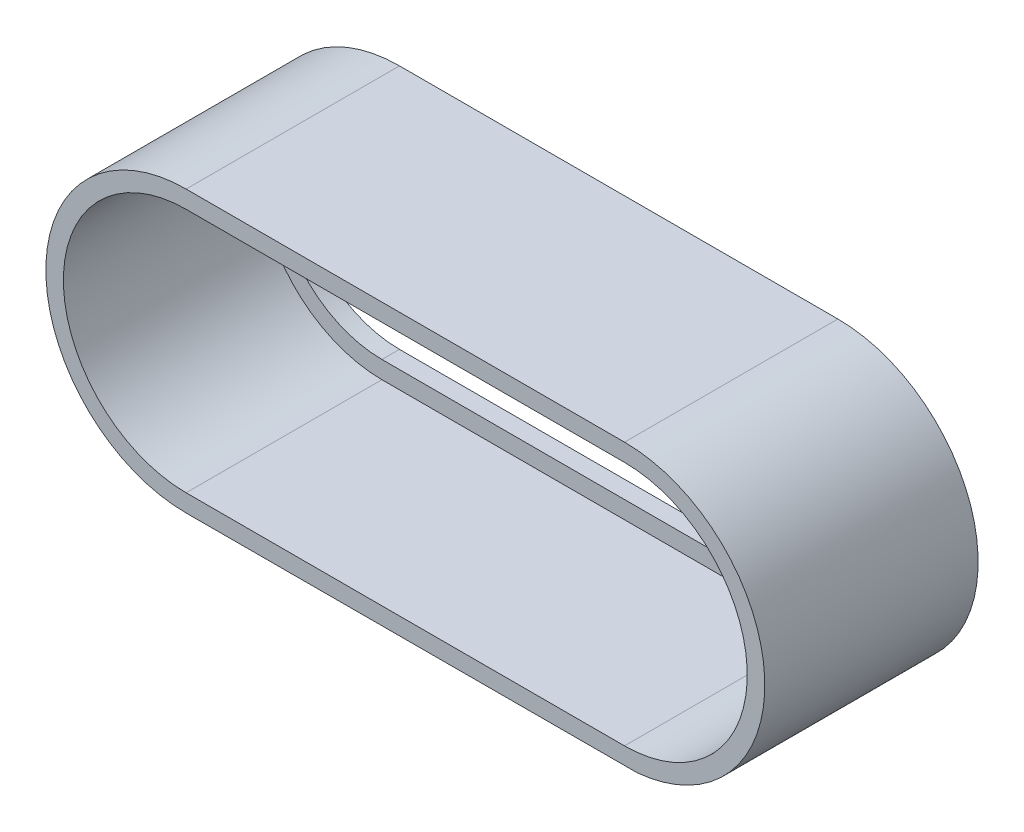
ISO-10303-21;
HEADER;
FILE_DESCRIPTION(('STEP AP214'),'2;1');
FILE_NAME('part.step','',(''),(''),'','','');
FILE_SCHEMA(('AUTOMOTIVE_DESIGN { 1 0 10303 214 1 1 1 1 }'));
ENDSEC;
DATA;
#1=APPLICATION_CONTEXT('core data for automotive mechanical design processes');
#2=APPLICATION_PROTOCOL_DEFINITION('international standard','automotive_design',2000,#1);
#3=PRODUCT_CONTEXT('',#1,'mechanical');
#4=PRODUCT('Part','Part','',(#3));
#5=PRODUCT_RELATED_PRODUCT_CATEGORY('part','',(#4));
#6=PRODUCT_DEFINITION_FORMATION('','',#4);
#7=PRODUCT_DEFINITION_CONTEXT('part definition',#1,'design');
#8=PRODUCT_DEFINITION('design','',#6,#7);
#9=PRODUCT_DEFINITION_SHAPE('','',#8);
#10=(LENGTH_UNIT() NAMED_UNIT(*) SI_UNIT(.MILLI.,.METRE.));
#11=(NAMED_UNIT(*) PLANE_ANGLE_UNIT() SI_UNIT($,.RADIAN.));
#12=(NAMED_UNIT(*) SI_UNIT($,.STERADIAN.) SOLID_ANGLE_UNIT());
#13=UNCERTAINTY_MEASURE_WITH_UNIT(LENGTH_MEASURE(1.E-05),#10,'distance_accuracy_value','');
#14=(GEOMETRIC_REPRESENTATION_CONTEXT(3) GLOBAL_UNCERTAINTY_ASSIGNED_CONTEXT((#13)) GLOBAL_UNIT_ASSIGNED_CONTEXT((#10,
#11,#12)) REPRESENTATION_CONTEXT('',''));
#15=CARTESIAN_POINT('',(0.,0.,0.));
#16=DIRECTION('',(0.,0.,1.));
#17=DIRECTION('',(1.,0.,0.));
#18=AXIS2_PLACEMENT_3D('',#15,#16,#17);
#19=CARTESIAN_POINT('',(0.,0.,3.));
#20=DIRECTION('',(0.,0.,1.));
#21=DIRECTION('',(1.,0.,0.));
#22=AXIS2_PLACEMENT_3D('',#19,#20,#21);
#23=PLANE('',#22);
#24=DIRECTION('',(1.,0.,0.));
#25=VECTOR('',#24,1.);
#26=CARTESIAN_POINT('',(0.,-21.,3.));
#27=LINE('',#26,#25);
#28=CARTESIAN_POINT('',(-37.5,-21.,3.));
#29=VERTEX_POINT('',#28);
#30=CARTESIAN_POINT('',(37.5,-21.,3.));
#31=VERTEX_POINT('',#30);
#32=EDGE_CURVE('E238',#29,#31,#27,.T.);
#33=ORIENTED_EDGE('',*,*,#32,.T.);
#34=CARTESIAN_POINT('',(37.5,0.,3.));
#35=DIRECTION('',(0.,0.,1.));
#36=DIRECTION('',(1.,0.,0.));
#37=AXIS2_PLACEMENT_3D('',#34,#35,#36);
#38=CIRCLE('',#37,21.);
#39=CARTESIAN_POINT('',(37.5,21.,3.));
#40=VERTEX_POINT('',#39);
#41=EDGE_CURVE('E201',#40,#31,#38,.F.);
#42=ORIENTED_EDGE('',*,*,#41,.F.);
#43=DIRECTION('',(-1.,0.,0.));
#44=VECTOR('',#43,1.);
#45=CARTESIAN_POINT('',(0.,21.,3.));
#46=LINE('',#45,#44);
#47=CARTESIAN_POINT('',(-37.5,21.,3.));
#48=VERTEX_POINT('',#47);
#49=EDGE_CURVE('E206',#40,#48,#46,.T.);
#50=ORIENTED_EDGE('',*,*,#49,.T.);
#51=CARTESIAN_POINT('',(-37.5,0.,3.));
#52=DIRECTION('',(0.,0.,1.));
#53=DIRECTION('',(1.,0.,0.));
#54=AXIS2_PLACEMENT_3D('',#51,#52,#53);
#55=CIRCLE('',#54,21.);
#56=EDGE_CURVE('E241',#48,#29,#55,.T.);
#57=ORIENTED_EDGE('',*,*,#56,.T.);
#58=EDGE_LOOP('',(#33,#42,#50,#57));
#59=FACE_BOUND('',#58,.T.);
#60=CARTESIAN_POINT('',(37.5,0.,3.));
#61=DIRECTION('',(0.,0.,1.));
#62=DIRECTION('',(1.,0.,0.));
#63=AXIS2_PLACEMENT_3D('',#60,#61,#62);
#64=CIRCLE('',#63,18.);
#65=CARTESIAN_POINT('',(37.5,18.,3.));
#66=VERTEX_POINT('',#65);
#67=CARTESIAN_POINT('',(37.5,-18.,3.));
#68=VERTEX_POINT('',#67);
#69=EDGE_CURVE('E178',#66,#68,#64,.F.);
#70=ORIENTED_EDGE('',*,*,#69,.T.);
#71=DIRECTION('',(-1.,0.,0.));
#72=VECTOR('',#71,1.);
#73=CARTESIAN_POINT('',(0.,-18.,3.));
#74=LINE('',#73,#72);
#75=CARTESIAN_POINT('',(-37.5,-18.,3.));
#76=VERTEX_POINT('',#75);
#77=EDGE_CURVE('E171',#68,#76,#74,.T.);
#78=ORIENTED_EDGE('',*,*,#77,.T.);
#79=CARTESIAN_POINT('',(-37.5,0.,3.));
#80=DIRECTION('',(0.,0.,1.));
#81=DIRECTION('',(1.,0.,0.));
#82=AXIS2_PLACEMENT_3D('',#79,#80,#81);
#83=CIRCLE('',#82,18.);
#84=CARTESIAN_POINT('',(-37.5,18.,3.));
#85=VERTEX_POINT('',#84);
#86=EDGE_CURVE('E157',#85,#76,#83,.T.);
#87=ORIENTED_EDGE('',*,*,#86,.F.);
#88=DIRECTION('',(1.,0.,0.));
#89=VECTOR('',#88,1.);
#90=CARTESIAN_POINT('',(0.,18.,3.));
#91=LINE('',#90,#89);
#92=EDGE_CURVE('E192',#85,#66,#91,.T.);
#93=ORIENTED_EDGE('',*,*,#92,.T.);
#94=EDGE_LOOP('',(#70,#78,#87,#93));
#95=FACE_BOUND('',#94,.T.);
#96=ADVANCED_FACE('F71',(#59,#95),#23,.T.);
#97=CARTESIAN_POINT('',(0.0303655356954063,-23.952421108113,3.));
#98=DIRECTION('',(-0.00126774287897735,0.999999196413673,0.));
#99=DIRECTION('',(-0.999999196413674,-0.00126774287897735,0.));
#100=AXIS2_PLACEMENT_3D('',#97,#98,#99);
#101=PLANE('',#100);
#102=DIRECTION('',(0.999999196413674,0.00126774287897735,0.));
#103=VECTOR('',#102,1.);
#104=CARTESIAN_POINT('',(0.0303655356954063,-23.952421108113,0.));
#105=LINE('',#104,#103);
#106=CARTESIAN_POINT('',(-37.4391483907022,-23.9999228557436,0.));
#107=VERTEX_POINT('',#106);
#108=CARTESIAN_POINT('',(39.6647252730943,-23.9021748904159,0.));
#109=VERTEX_POINT('',#108);
#110=EDGE_CURVE('E261',#107,#109,#105,.T.);
#111=ORIENTED_EDGE('',*,*,#110,.T.);
#112=DIRECTION('',(0.,0.,-1.));
#113=VECTOR('',#112,1.);
#114=CARTESIAN_POINT('',(39.6647252730943,-23.9021748904159,3.));
#115=LINE('',#114,#113);
#116=CARTESIAN_POINT('',(39.6647252730943,-23.9021748904159,36.5));
#117=VERTEX_POINT('',#116);
#118=EDGE_CURVE('E81',#117,#109,#115,.T.);
#119=ORIENTED_EDGE('',*,*,#118,.F.);
#120=DIRECTION('',(0.999999196413674,0.00126774287897735,0.));
#121=VECTOR('',#120,1.);
#122=CARTESIAN_POINT('',(0.0303655356954063,-23.952421108113,36.5));
#123=LINE('',#122,#121);
#124=CARTESIAN_POINT('',(-37.4391483907022,-23.9999228557436,36.5));
#125=VERTEX_POINT('',#124);
#126=EDGE_CURVE('E218',#125,#117,#123,.T.);
#127=ORIENTED_EDGE('',*,*,#126,.F.);
#128=DIRECTION('',(0.,0.,-1.));
#129=VECTOR('',#128,1.);
#130=CARTESIAN_POINT('',(-37.4391483907022,-23.9999228557436,3.));
#131=LINE('',#130,#129);
#132=EDGE_CURVE('E12',#125,#107,#131,.T.);
#133=ORIENTED_EDGE('',*,*,#132,.T.);
#134=EDGE_LOOP('',(#111,#119,#127,#133));
#135=FACE_BOUND('',#134,.T.);
#136=ADVANCED_FACE('F287',(#135),#101,.F.);
#137=CARTESIAN_POINT('',(37.5,0.,3.));
#138=DIRECTION('',(0.,0.,-1.));
#139=DIRECTION('',(-1.,0.,0.));
#140=AXIS2_PLACEMENT_3D('',#137,#138,#139);
#141=CYLINDRICAL_SURFACE('',#140,24.);
#142=CARTESIAN_POINT('',(37.5,0.,0.));
#143=DIRECTION('',(0.,0.,1.));
#144=DIRECTION('',(1.,0.,0.));
#145=AXIS2_PLACEMENT_3D('',#142,#143,#144);
#146=CIRCLE('',#145,24.);
#147=CARTESIAN_POINT('',(37.5,24.,0.));
#148=VERTEX_POINT('',#147);
#149=EDGE_CURVE('E265',#148,#109,#146,.F.);
#150=ORIENTED_EDGE('',*,*,#149,.F.);
#151=DIRECTION('',(0.,0.,-1.));
#152=VECTOR('',#151,1.);
#153=CARTESIAN_POINT('',(37.5,24.,3.));
#154=LINE('',#153,#152);
#155=CARTESIAN_POINT('',(37.5,24.,36.5));
#156=VERTEX_POINT('',#155);
#157=EDGE_CURVE('E276',#156,#148,#154,.T.);
#158=ORIENTED_EDGE('',*,*,#157,.F.);
#159=CARTESIAN_POINT('',(37.5,0.,36.5));
#160=DIRECTION('',(0.,0.,1.));
#161=DIRECTION('',(1.,0.,0.));
#162=AXIS2_PLACEMENT_3D('',#159,#160,#161);
#163=CIRCLE('',#162,24.);
#164=EDGE_CURVE('E222',#117,#156,#163,.T.);
#165=ORIENTED_EDGE('',*,*,#164,.F.);
#166=ORIENTED_EDGE('',*,*,#118,.T.);
#167=EDGE_LOOP('',(#150,#158,#165,#166));
#168=FACE_BOUND('',#167,.T.);
#169=ADVANCED_FACE('F283',(#168),#141,.T.);
#170=CARTESIAN_POINT('',(0.,24.,3.));
#171=DIRECTION('',(0.,-1.,0.));
#172=DIRECTION('',(1.,0.,0.));
#173=AXIS2_PLACEMENT_3D('',#170,#171,#172);
#174=PLANE('',#173);
#175=DIRECTION('',(-1.,0.,0.));
#176=VECTOR('',#175,1.);
#177=CARTESIAN_POINT('',(0.,24.,0.));
#178=LINE('',#177,#176);
#179=CARTESIAN_POINT('',(-37.5,24.,0.));
#180=VERTEX_POINT('',#179);
#181=EDGE_CURVE('E269',#148,#180,#178,.T.);
#182=ORIENTED_EDGE('',*,*,#181,.T.);
#183=DIRECTION('',(0.,0.,-1.));
#184=VECTOR('',#183,1.);
#185=CARTESIAN_POINT('',(-37.5,24.,3.));
#186=LINE('',#185,#184);
#187=CARTESIAN_POINT('',(-37.5,24.,36.5));
#188=VERTEX_POINT('',#187);
#189=EDGE_CURVE('E273',#188,#180,#186,.T.);
#190=ORIENTED_EDGE('',*,*,#189,.F.);
#191=DIRECTION('',(-1.,0.,0.));
#192=VECTOR('',#191,1.);
#193=CARTESIAN_POINT('',(0.,24.,36.5));
#194=LINE('',#193,#192);
#195=EDGE_CURVE('E226',#156,#188,#194,.T.);
#196=ORIENTED_EDGE('',*,*,#195,.F.);
#197=ORIENTED_EDGE('',*,*,#157,.T.);
#198=EDGE_LOOP('',(#182,#190,#196,#197));
#199=FACE_BOUND('',#198,.T.);
#200=ADVANCED_FACE('F294',(#199),#174,.F.);
#201=CARTESIAN_POINT('',(0.,0.,0.));
#202=DIRECTION('',(0.,0.,1.));
#203=DIRECTION('',(1.,0.,0.));
#204=AXIS2_PLACEMENT_3D('',#201,#202,#203);
#205=PLANE('',#204);
#206=DIRECTION('',(-1.,0.,0.));
#207=VECTOR('',#206,1.);
#208=CARTESIAN_POINT('',(0.,-18.,0.));
#209=LINE('',#208,#207);
#210=CARTESIAN_POINT('',(37.5,-18.,0.));
#211=VERTEX_POINT('',#210);
#212=CARTESIAN_POINT('',(-37.5,-18.,0.));
#213=VERTEX_POINT('',#212);
#214=EDGE_CURVE('E174',#211,#213,#209,.T.);
#215=ORIENTED_EDGE('',*,*,#214,.F.);
#216=CARTESIAN_POINT('',(37.5,0.,0.));
#217=DIRECTION('',(0.,0.,-1.));
#218=DIRECTION('',(-1.,0.,0.));
#219=AXIS2_PLACEMENT_3D('',#216,#217,#218);
#220=CIRCLE('',#219,18.);
#221=CARTESIAN_POINT('',(37.5,18.,0.));
#222=VERTEX_POINT('',#221);
#223=EDGE_CURVE('E166',#222,#211,#220,.T.);
#224=ORIENTED_EDGE('',*,*,#223,.F.);
#225=DIRECTION('',(1.,0.,0.));
#226=VECTOR('',#225,1.);
#227=CARTESIAN_POINT('',(0.,18.,0.));
#228=LINE('',#227,#226);
#229=CARTESIAN_POINT('',(-37.5,18.,0.));
#230=VERTEX_POINT('',#229);
#231=EDGE_CURVE('E180',#230,#222,#228,.T.);
#232=ORIENTED_EDGE('',*,*,#231,.F.);
#233=CARTESIAN_POINT('',(-37.5,0.,0.));
#234=DIRECTION('',(0.,0.,-1.));
#235=DIRECTION('',(-1.,0.,0.));
#236=AXIS2_PLACEMENT_3D('',#233,#234,#235);
#237=CIRCLE('',#236,18.);
#238=EDGE_CURVE('E93',#230,#213,#237,.F.);
#239=ORIENTED_EDGE('',*,*,#238,.T.);
#240=EDGE_LOOP('',(#215,#224,#232,#239));
#241=FACE_BOUND('',#240,.T.);
#242=ORIENTED_EDGE('',*,*,#110,.F.);
#243=CARTESIAN_POINT('',(-37.5,0.,0.));
#244=DIRECTION('',(0.,0.,1.));
#245=DIRECTION('',(1.,0.,0.));
#246=AXIS2_PLACEMENT_3D('',#243,#244,#245);
#247=CIRCLE('',#246,24.);
#248=EDGE_CURVE('E75',#180,#107,#247,.T.);
#249=ORIENTED_EDGE('',*,*,#248,.F.);
#250=ORIENTED_EDGE('',*,*,#181,.F.);
#251=ORIENTED_EDGE('',*,*,#149,.T.);
#252=EDGE_LOOP('',(#242,#249,#250,#251));
#253=FACE_BOUND('',#252,.T.);
#254=ADVANCED_FACE('F292',(#241,#253),#205,.F.);
#255=CARTESIAN_POINT('',(-37.5,0.,3.));
#256=DIRECTION('',(0.,0.,-1.));
#257=DIRECTION('',(-1.,0.,0.));
#258=AXIS2_PLACEMENT_3D('',#255,#256,#257);
#259=CYLINDRICAL_SURFACE('',#258,24.);
#260=ORIENTED_EDGE('',*,*,#248,.T.);
#261=ORIENTED_EDGE('',*,*,#132,.F.);
#262=CARTESIAN_POINT('',(-37.5,0.,36.5));
#263=DIRECTION('',(0.,0.,1.));
#264=DIRECTION('',(1.,0.,0.));
#265=AXIS2_PLACEMENT_3D('',#262,#263,#264);
#266=CIRCLE('',#265,24.);
#267=EDGE_CURVE('E230',#188,#125,#266,.T.);
#268=ORIENTED_EDGE('',*,*,#267,.F.);
#269=ORIENTED_EDGE('',*,*,#189,.T.);
#270=EDGE_LOOP('',(#260,#261,#268,#269));
#271=FACE_BOUND('',#270,.T.);
#272=ADVANCED_FACE('F73',(#271),#259,.T.);
#273=CARTESIAN_POINT('',(37.5,0.,36.5));
#274=DIRECTION('',(0.,0.,-1.));
#275=DIRECTION('',(-1.,0.,0.));
#276=AXIS2_PLACEMENT_3D('',#273,#274,#275);
#277=CYLINDRICAL_SURFACE('',#276,21.);
#278=ORIENTED_EDGE('',*,*,#41,.T.);
#279=DIRECTION('',(0.,0.,-1.));
#280=VECTOR('',#279,1.);
#281=CARTESIAN_POINT('',(37.5,-21.,36.5));
#282=LINE('',#281,#280);
#283=CARTESIAN_POINT('',(37.5,-21.,36.5));
#284=VERTEX_POINT('',#283);
#285=EDGE_CURVE('E257',#284,#31,#282,.T.);
#286=ORIENTED_EDGE('',*,*,#285,.F.);
#287=CARTESIAN_POINT('',(37.5,0.,36.5));
#288=DIRECTION('',(0.,0.,1.));
#289=DIRECTION('',(1.,0.,0.));
#290=AXIS2_PLACEMENT_3D('',#287,#288,#289);
#291=CIRCLE('',#290,21.);
#292=CARTESIAN_POINT('',(37.5,21.,36.5));
#293=VERTEX_POINT('',#292);
#294=EDGE_CURVE('E202',#293,#284,#291,.F.);
#295=ORIENTED_EDGE('',*,*,#294,.F.);
#296=DIRECTION('',(0.,0.,-1.));
#297=VECTOR('',#296,1.);
#298=CARTESIAN_POINT('',(37.5,21.,36.5));
#299=LINE('',#298,#297);
#300=EDGE_CURVE('E234',#293,#40,#299,.T.);
#301=ORIENTED_EDGE('',*,*,#300,.T.);
#302=EDGE_LOOP('',(#278,#286,#295,#301));
#303=FACE_BOUND('',#302,.T.);
#304=ADVANCED_FACE('F317',(#303),#277,.F.);
#305=CARTESIAN_POINT('',(0.,-21.,36.5));
#306=DIRECTION('',(0.,1.,0.));
#307=DIRECTION('',(-1.,0.,0.));
#308=AXIS2_PLACEMENT_3D('',#305,#306,#307);
#309=PLANE('',#308);
#310=ORIENTED_EDGE('',*,*,#32,.F.);
#311=DIRECTION('',(0.,0.,-1.));
#312=VECTOR('',#311,1.);
#313=CARTESIAN_POINT('',(-37.5,-21.,36.5));
#314=LINE('',#313,#312);
#315=CARTESIAN_POINT('',(-37.5,-21.,36.5));
#316=VERTEX_POINT('',#315);
#317=EDGE_CURVE('E253',#316,#29,#314,.T.);
#318=ORIENTED_EDGE('',*,*,#317,.F.);
#319=DIRECTION('',(1.,0.,0.));
#320=VECTOR('',#319,1.);
#321=CARTESIAN_POINT('',(0.,-21.,36.5));
#322=LINE('',#321,#320);
#323=EDGE_CURVE('E205',#316,#284,#322,.T.);
#324=ORIENTED_EDGE('',*,*,#323,.T.);
#325=ORIENTED_EDGE('',*,*,#285,.T.);
#326=EDGE_LOOP('',(#310,#318,#324,#325));
#327=FACE_BOUND('',#326,.T.);
#328=ADVANCED_FACE('F328',(#327),#309,.T.);
#329=CARTESIAN_POINT('',(-37.5,0.,36.5));
#330=DIRECTION('',(0.,0.,-1.));
#331=DIRECTION('',(-1.,0.,0.));
#332=AXIS2_PLACEMENT_3D('',#329,#330,#331);
#333=CYLINDRICAL_SURFACE('',#332,21.);
#334=ORIENTED_EDGE('',*,*,#56,.F.);
#335=DIRECTION('',(0.,0.,-1.));
#336=VECTOR('',#335,1.);
#337=CARTESIAN_POINT('',(-37.5,21.,36.5));
#338=LINE('',#337,#336);
#339=CARTESIAN_POINT('',(-37.5,21.,36.5));
#340=VERTEX_POINT('',#339);
#341=EDGE_CURVE('E249',#340,#48,#338,.T.);
#342=ORIENTED_EDGE('',*,*,#341,.F.);
#343=CARTESIAN_POINT('',(-37.5,0.,36.5));
#344=DIRECTION('',(0.,0.,1.));
#345=DIRECTION('',(1.,0.,0.));
#346=AXIS2_PLACEMENT_3D('',#343,#344,#345);
#347=CIRCLE('',#346,21.);
#348=EDGE_CURVE('E210',#340,#316,#347,.T.);
#349=ORIENTED_EDGE('',*,*,#348,.T.);
#350=ORIENTED_EDGE('',*,*,#317,.T.);
#351=EDGE_LOOP('',(#334,#342,#349,#350));
#352=FACE_BOUND('',#351,.T.);
#353=ADVANCED_FACE('F332',(#352),#333,.F.);
#354=CARTESIAN_POINT('',(0.,21.,36.5));
#355=DIRECTION('',(0.,-1.,0.));
#356=DIRECTION('',(1.,0.,0.));
#357=AXIS2_PLACEMENT_3D('',#354,#355,#356);
#358=PLANE('',#357);
#359=ORIENTED_EDGE('',*,*,#49,.F.);
#360=ORIENTED_EDGE('',*,*,#300,.F.);
#361=DIRECTION('',(-1.,0.,0.));
#362=VECTOR('',#361,1.);
#363=CARTESIAN_POINT('',(0.,21.,36.5));
#364=LINE('',#363,#362);
#365=EDGE_CURVE('E214',#293,#340,#364,.T.);
#366=ORIENTED_EDGE('',*,*,#365,.T.);
#367=ORIENTED_EDGE('',*,*,#341,.T.);
#368=EDGE_LOOP('',(#359,#360,#366,#367));
#369=FACE_BOUND('',#368,.T.);
#370=ADVANCED_FACE('F336',(#369),#358,.T.);
#371=CARTESIAN_POINT('',(0.,0.,36.5));
#372=DIRECTION('',(0.,0.,1.));
#373=DIRECTION('',(1.,0.,0.));
#374=AXIS2_PLACEMENT_3D('',#371,#372,#373);
#375=PLANE('',#374);
#376=ORIENTED_EDGE('',*,*,#294,.T.);
#377=ORIENTED_EDGE('',*,*,#323,.F.);
#378=ORIENTED_EDGE('',*,*,#348,.F.);
#379=ORIENTED_EDGE('',*,*,#365,.F.);
#380=EDGE_LOOP('',(#376,#377,#378,#379));
#381=FACE_BOUND('',#380,.T.);
#382=ORIENTED_EDGE('',*,*,#126,.T.);
#383=ORIENTED_EDGE('',*,*,#164,.T.);
#384=ORIENTED_EDGE('',*,*,#195,.T.);
#385=ORIENTED_EDGE('',*,*,#267,.T.);
#386=EDGE_LOOP('',(#382,#383,#384,#385));
#387=FACE_BOUND('',#386,.T.);
#388=ADVANCED_FACE('F297',(#381,#387),#375,.T.);
#389=CARTESIAN_POINT('',(37.5,0.,119.69190203266));
#390=DIRECTION('',(0.,0.,-1.));
#391=DIRECTION('',(-1.,0.,0.));
#392=AXIS2_PLACEMENT_3D('',#389,#390,#391);
#393=CYLINDRICAL_SURFACE('',#392,18.);
#394=DIRECTION('',(0.,0.,-1.));
#395=VECTOR('',#394,1.);
#396=CARTESIAN_POINT('',(37.5,18.,119.69190203266));
#397=LINE('',#396,#395);
#398=EDGE_CURVE('E191',#66,#222,#397,.T.);
#399=ORIENTED_EDGE('',*,*,#398,.T.);
#400=ORIENTED_EDGE('',*,*,#223,.T.);
#401=DIRECTION('',(0.,0.,-1.));
#402=VECTOR('',#401,1.);
#403=CARTESIAN_POINT('',(37.5,-18.,119.69190203266));
#404=LINE('',#403,#402);
#405=EDGE_CURVE('E190',#68,#211,#404,.T.);
#406=ORIENTED_EDGE('',*,*,#405,.F.);
#407=ORIENTED_EDGE('',*,*,#69,.F.);
#408=EDGE_LOOP('',(#399,#400,#406,#407));
#409=FACE_BOUND('',#408,.T.);
#410=ADVANCED_FACE('F310',(#409),#393,.F.);
#411=CARTESIAN_POINT('',(0.,-18.,119.69190203266));
#412=DIRECTION('',(0.,-1.,0.));
#413=DIRECTION('',(1.,0.,0.));
#414=AXIS2_PLACEMENT_3D('',#411,#412,#413);
#415=PLANE('',#414);
#416=ORIENTED_EDGE('',*,*,#405,.T.);
#417=ORIENTED_EDGE('',*,*,#214,.T.);
#418=DIRECTION('',(0.,0.,-1.));
#419=VECTOR('',#418,1.);
#420=CARTESIAN_POINT('',(-37.5,-18.,119.69190203266));
#421=LINE('',#420,#419);
#422=EDGE_CURVE('E160',#76,#213,#421,.T.);
#423=ORIENTED_EDGE('',*,*,#422,.F.);
#424=ORIENTED_EDGE('',*,*,#77,.F.);
#425=EDGE_LOOP('',(#416,#417,#423,#424));
#426=FACE_BOUND('',#425,.T.);
#427=ADVANCED_FACE('F170',(#426),#415,.F.);
#428=CARTESIAN_POINT('',(-37.5,0.,119.69190203266));
#429=DIRECTION('',(0.,0.,-1.));
#430=DIRECTION('',(-1.,0.,0.));
#431=AXIS2_PLACEMENT_3D('',#428,#429,#430);
#432=CYLINDRICAL_SURFACE('',#431,18.);
#433=ORIENTED_EDGE('',*,*,#86,.T.);
#434=ORIENTED_EDGE('',*,*,#422,.T.);
#435=ORIENTED_EDGE('',*,*,#238,.F.);
#436=DIRECTION('',(0.,0.,-1.));
#437=VECTOR('',#436,1.);
#438=CARTESIAN_POINT('',(-37.5,18.,119.69190203266));
#439=LINE('',#438,#437);
#440=EDGE_CURVE('E88',#85,#230,#439,.T.);
#441=ORIENTED_EDGE('',*,*,#440,.F.);
#442=EDGE_LOOP('',(#433,#434,#435,#441));
#443=FACE_BOUND('',#442,.T.);
#444=ADVANCED_FACE('F159',(#443),#432,.F.);
#445=CARTESIAN_POINT('',(0.,18.,119.69190203266));
#446=DIRECTION('',(0.,1.,0.));
#447=DIRECTION('',(-1.,0.,0.));
#448=AXIS2_PLACEMENT_3D('',#445,#446,#447);
#449=PLANE('',#448);
#450=ORIENTED_EDGE('',*,*,#440,.T.);
#451=ORIENTED_EDGE('',*,*,#231,.T.);
#452=ORIENTED_EDGE('',*,*,#398,.F.);
#453=ORIENTED_EDGE('',*,*,#92,.F.);
#454=EDGE_LOOP('',(#450,#451,#452,#453));
#455=FACE_BOUND('',#454,.T.);
#456=ADVANCED_FACE('F348',(#455),#449,.F.);
#457=CLOSED_SHELL('',(#96,#136,#169,#200,#254,#272,#304,#328,#353,#370,#388,#410,#427,#444,#456));
#458=MANIFOLD_SOLID_BREP('B2',#457);
#459=ADVANCED_BREP_SHAPE_REPRESENTATION('',(#18,#458),#14);
#460=SHAPE_DEFINITION_REPRESENTATION(#9,#459);
ENDSEC;
END-ISO-10303-21;
